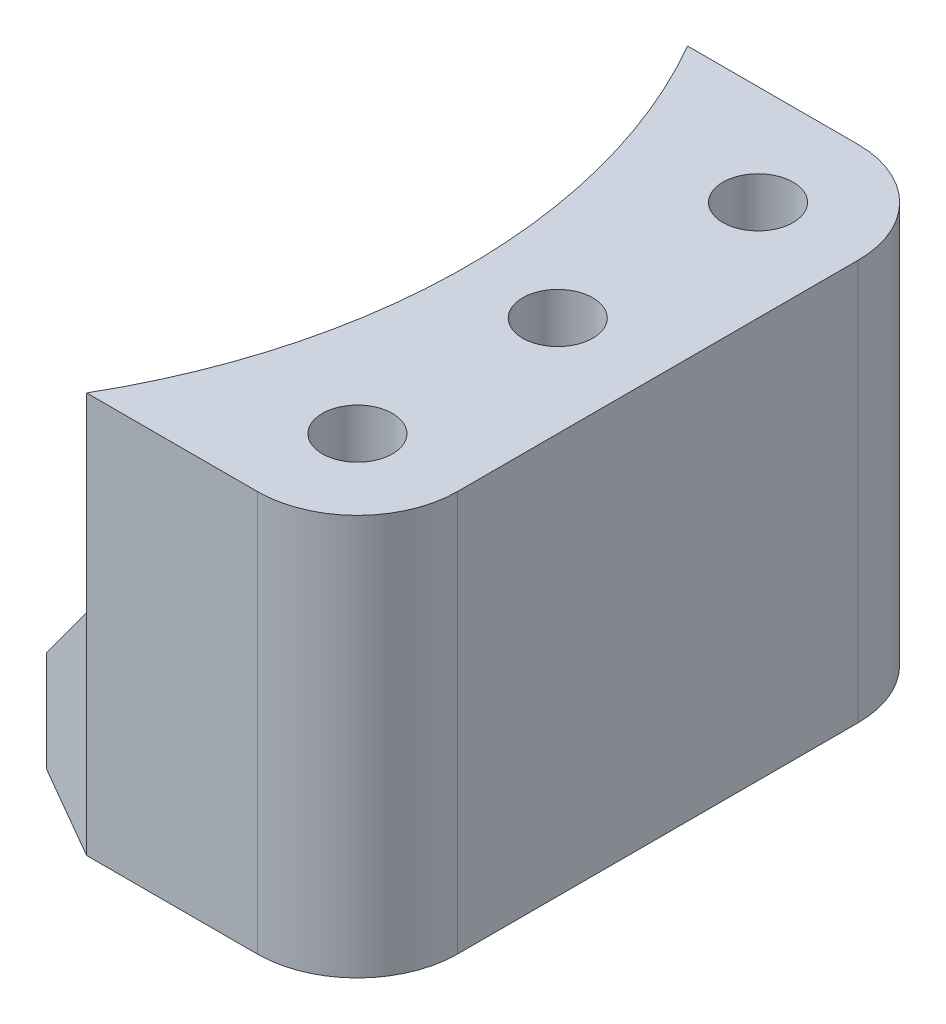
ISO-10303-21;
HEADER;
FILE_DESCRIPTION(('STEP AP214'),'2;1');
FILE_NAME('part.step','',(''),(''),'','','');
FILE_SCHEMA(('AUTOMOTIVE_DESIGN { 1 0 10303 214 1 1 1 1 }'));
ENDSEC;
DATA;
#1=APPLICATION_CONTEXT('core data for automotive mechanical design processes');
#2=APPLICATION_PROTOCOL_DEFINITION('international standard','automotive_design',2000,#1);
#3=PRODUCT_CONTEXT('',#1,'mechanical');
#4=PRODUCT('Part','Part','',(#3));
#5=PRODUCT_RELATED_PRODUCT_CATEGORY('part','',(#4));
#6=PRODUCT_DEFINITION_FORMATION('','',#4);
#7=PRODUCT_DEFINITION_CONTEXT('part definition',#1,'design');
#8=PRODUCT_DEFINITION('design','',#6,#7);
#9=PRODUCT_DEFINITION_SHAPE('','',#8);
#10=(LENGTH_UNIT() NAMED_UNIT(*) SI_UNIT(.MILLI.,.METRE.));
#11=(NAMED_UNIT(*) PLANE_ANGLE_UNIT() SI_UNIT($,.RADIAN.));
#12=(NAMED_UNIT(*) SI_UNIT($,.STERADIAN.) SOLID_ANGLE_UNIT());
#13=UNCERTAINTY_MEASURE_WITH_UNIT(LENGTH_MEASURE(1.E-05),#10,'distance_accuracy_value','');
#14=(GEOMETRIC_REPRESENTATION_CONTEXT(3) GLOBAL_UNCERTAINTY_ASSIGNED_CONTEXT((#13)) GLOBAL_UNIT_ASSIGNED_CONTEXT((#10,
#11,#12)) REPRESENTATION_CONTEXT('',''));
#15=CARTESIAN_POINT('',(0.,0.,0.));
#16=DIRECTION('',(0.,0.,1.));
#17=DIRECTION('',(1.,0.,0.));
#18=AXIS2_PLACEMENT_3D('',#15,#16,#17);
#19=CARTESIAN_POINT('',(38.5381304684075,20.,-22.25));
#20=DIRECTION('',(0.,1.,0.));
#21=DIRECTION('',(0.,0.,1.));
#22=AXIS2_PLACEMENT_3D('',#19,#20,#21);
#23=PLANE('',#22);
#24=CARTESIAN_POINT('',(34.5,20.,0.));
#25=DIRECTION('',(0.,1.,0.));
#26=DIRECTION('',(0.,0.,1.));
#27=AXIS2_PLACEMENT_3D('',#24,#25,#26);
#28=CIRCLE('',#27,1.75);
#29=CARTESIAN_POINT('',(34.5,20.,1.75));
#30=VERTEX_POINT('',#29);
#31=EDGE_CURVE('E187',#30,#30,#28,.T.);
#32=ORIENTED_EDGE('',*,*,#31,.F.);
#33=EDGE_LOOP('',(#32));
#34=FACE_BOUND('',#33,.T.);
#35=CARTESIAN_POINT('',(34.5,20.,-10.));
#36=DIRECTION('',(0.,1.,0.));
#37=DIRECTION('',(0.,0.,1.));
#38=AXIS2_PLACEMENT_3D('',#35,#36,#37);
#39=CIRCLE('',#38,1.75);
#40=CARTESIAN_POINT('',(34.5,20.,-8.25));
#41=VERTEX_POINT('',#40);
#42=EDGE_CURVE('E177',#41,#41,#39,.T.);
#43=ORIENTED_EDGE('',*,*,#42,.F.);
#44=EDGE_LOOP('',(#43));
#45=FACE_BOUND('',#44,.T.);
#46=CARTESIAN_POINT('',(34.5,20.,10.));
#47=DIRECTION('',(0.,1.,0.));
#48=DIRECTION('',(0.,0.,1.));
#49=AXIS2_PLACEMENT_3D('',#46,#47,#48);
#50=CIRCLE('',#49,1.75);
#51=CARTESIAN_POINT('',(34.5,20.,11.75));
#52=VERTEX_POINT('',#51);
#53=EDGE_CURVE('E174',#52,#52,#50,.T.);
#54=ORIENTED_EDGE('',*,*,#53,.F.);
#55=EDGE_LOOP('',(#54));
#56=FACE_BOUND('',#55,.T.);
#57=DIRECTION('',(0.,0.,1.));
#58=VECTOR('',#57,1.);
#59=CARTESIAN_POINT('',(39.5,20.,-22.25));
#60=LINE('',#59,#58);
#61=CARTESIAN_POINT('',(39.5,20.,-10.));
#62=VERTEX_POINT('',#61);
#63=CARTESIAN_POINT('',(39.5,20.,10.));
#64=VERTEX_POINT('',#63);
#65=EDGE_CURVE('E197',#62,#64,#60,.T.);
#66=ORIENTED_EDGE('',*,*,#65,.F.);
#67=CARTESIAN_POINT('',(34.5,20.,-10.));
#68=DIRECTION('',(0.,1.,0.));
#69=DIRECTION('',(0.,0.,1.));
#70=AXIS2_PLACEMENT_3D('',#67,#68,#69);
#71=CIRCLE('',#70,5.);
#72=CARTESIAN_POINT('',(34.5,20.,-15.));
#73=VERTEX_POINT('',#72);
#74=EDGE_CURVE('E42',#62,#73,#71,.T.);
#75=ORIENTED_EDGE('',*,*,#74,.T.);
#76=DIRECTION('',(1.,0.,0.));
#77=VECTOR('',#76,1.);
#78=CARTESIAN_POINT('',(38.5381304684075,20.,-15.));
#79=LINE('',#78,#77);
#80=CARTESIAN_POINT('',(25.9807621135331,20.,-15.));
#81=VERTEX_POINT('',#80);
#82=EDGE_CURVE('E194',#81,#73,#79,.T.);
#83=ORIENTED_EDGE('',*,*,#82,.F.);
#84=CARTESIAN_POINT('',(0.,20.,0.));
#85=DIRECTION('',(0.,-1.,0.));
#86=DIRECTION('',(0.,0.,-1.));
#87=AXIS2_PLACEMENT_3D('',#84,#85,#86);
#88=CIRCLE('',#87,30.);
#89=CARTESIAN_POINT('',(25.9807621135331,20.,15.));
#90=VERTEX_POINT('',#89);
#91=EDGE_CURVE('E115',#81,#90,#88,.T.);
#92=ORIENTED_EDGE('',*,*,#91,.T.);
#93=DIRECTION('',(-1.,0.,0.));
#94=VECTOR('',#93,1.);
#95=CARTESIAN_POINT('',(38.5381304684075,20.,15.));
#96=LINE('',#95,#94);
#97=CARTESIAN_POINT('',(34.5,20.,15.));
#98=VERTEX_POINT('',#97);
#99=EDGE_CURVE('E124',#98,#90,#96,.T.);
#100=ORIENTED_EDGE('',*,*,#99,.F.);
#101=CARTESIAN_POINT('',(34.5,20.,10.));
#102=DIRECTION('',(0.,1.,0.));
#103=DIRECTION('',(0.,0.,1.));
#104=AXIS2_PLACEMENT_3D('',#101,#102,#103);
#105=CIRCLE('',#104,5.);
#106=EDGE_CURVE('E55',#98,#64,#105,.T.);
#107=ORIENTED_EDGE('',*,*,#106,.T.);
#108=EDGE_LOOP('',(#66,#75,#83,#92,#100,#107));
#109=FACE_BOUND('',#108,.T.);
#110=ADVANCED_FACE('F33',(#34,#45,#56,#109),#23,.T.);
#111=CARTESIAN_POINT('',(0.,0.,0.));
#112=DIRECTION('',(0.,-1.,0.));
#113=DIRECTION('',(0.,0.,-1.));
#114=AXIS2_PLACEMENT_3D('',#111,#112,#113);
#115=CYLINDRICAL_SURFACE('',#114,30.);
#116=CARTESIAN_POINT('',(0.,10.5,0.));
#117=DIRECTION('',(0.,-1.,0.));
#118=DIRECTION('',(0.,0.,-1.));
#119=AXIS2_PLACEMENT_3D('',#116,#117,#118);
#120=CIRCLE('',#119,30.);
#121=CARTESIAN_POINT('',(25.9807621135331,10.4999999999999,-15.));
#122=VERTEX_POINT('',#121);
#123=CARTESIAN_POINT('',(25.9807621135331,10.5,15.));
#124=VERTEX_POINT('',#123);
#125=EDGE_CURVE('E152',#122,#124,#120,.T.);
#126=ORIENTED_EDGE('',*,*,#125,.T.);
#127=DIRECTION('',(0.,-1.,0.));
#128=VECTOR('',#127,1.);
#129=CARTESIAN_POINT('',(25.9807621135331,20.,15.));
#130=LINE('',#129,#128);
#131=EDGE_CURVE('E109',#90,#124,#130,.T.);
#132=ORIENTED_EDGE('',*,*,#131,.F.);
#133=ORIENTED_EDGE('',*,*,#91,.F.);
#134=DIRECTION('',(0.,-1.,0.));
#135=VECTOR('',#134,1.);
#136=CARTESIAN_POINT('',(25.9807621135331,20.,-15.));
#137=LINE('',#136,#135);
#138=EDGE_CURVE('E131',#81,#122,#137,.T.);
#139=ORIENTED_EDGE('',*,*,#138,.T.);
#140=EDGE_LOOP('',(#126,#132,#133,#139));
#141=FACE_BOUND('',#140,.T.);
#142=ADVANCED_FACE('F215',(#141),#115,.F.);
#143=CARTESIAN_POINT('',(0.,10.5,0.));
#144=DIRECTION('',(0.,1.,0.));
#145=DIRECTION('',(0.,0.,1.));
#146=AXIS2_PLACEMENT_3D('',#143,#144,#145);
#147=CONICAL_SURFACE('',#146,30.,0.785398163397451);
#148=CARTESIAN_POINT('',(0.,5.,0.));
#149=DIRECTION('',(0.,-1.,0.));
#150=DIRECTION('',(0.,0.,-1.));
#151=AXIS2_PLACEMENT_3D('',#148,#149,#150);
#152=CIRCLE('',#151,24.5);
#153=CARTESIAN_POINT('',(21.2176223927187,5.,-12.25));
#154=VERTEX_POINT('',#153);
#155=CARTESIAN_POINT('',(21.2176223927187,5.,12.25));
#156=VERTEX_POINT('',#155);
#157=EDGE_CURVE('E150',#154,#156,#152,.T.);
#158=ORIENTED_EDGE('',*,*,#157,.T.);
#159=DIRECTION('',(-0.612372435695795,-0.707106781186546,-0.353553390593275));
#160=VECTOR('',#159,1.);
#161=CARTESIAN_POINT('',(25.9807621135331,10.5,15.));
#162=LINE('',#161,#160);
#163=EDGE_CURVE('E136',#124,#156,#162,.T.);
#164=ORIENTED_EDGE('',*,*,#163,.F.);
#165=ORIENTED_EDGE('',*,*,#125,.F.);
#166=DIRECTION('',(-0.612372435695795,-0.707106781186546,0.353553390593275));
#167=VECTOR('',#166,1.);
#168=CARTESIAN_POINT('',(25.9807621135331,10.5,-15.));
#169=LINE('',#168,#167);
#170=EDGE_CURVE('E134',#122,#154,#169,.T.);
#171=ORIENTED_EDGE('',*,*,#170,.T.);
#172=EDGE_LOOP('',(#158,#164,#165,#171));
#173=FACE_BOUND('',#172,.T.);
#174=ADVANCED_FACE('F212',(#173),#147,.F.);
#175=CARTESIAN_POINT('',(0.,0.,0.));
#176=DIRECTION('',(0.,-1.,0.));
#177=DIRECTION('',(0.,0.,-1.));
#178=AXIS2_PLACEMENT_3D('',#175,#176,#177);
#179=CYLINDRICAL_SURFACE('',#178,24.5);
#180=CARTESIAN_POINT('',(0.,0.,0.));
#181=DIRECTION('',(0.,-1.,0.));
#182=DIRECTION('',(0.,0.,-1.));
#183=AXIS2_PLACEMENT_3D('',#180,#181,#182);
#184=CIRCLE('',#183,24.5);
#185=CARTESIAN_POINT('',(21.2176223927187,0.,-12.25));
#186=VERTEX_POINT('',#185);
#187=CARTESIAN_POINT('',(21.2176223927187,0.,12.25));
#188=VERTEX_POINT('',#187);
#189=EDGE_CURVE('E148',#186,#188,#184,.T.);
#190=ORIENTED_EDGE('',*,*,#189,.T.);
#191=DIRECTION('',(0.,-1.,0.));
#192=VECTOR('',#191,1.);
#193=CARTESIAN_POINT('',(21.2176223927187,5.,12.25));
#194=LINE('',#193,#192);
#195=EDGE_CURVE('E130',#156,#188,#194,.T.);
#196=ORIENTED_EDGE('',*,*,#195,.F.);
#197=ORIENTED_EDGE('',*,*,#157,.F.);
#198=DIRECTION('',(0.,-1.,0.));
#199=VECTOR('',#198,1.);
#200=CARTESIAN_POINT('',(21.2176223927187,5.,-12.25));
#201=LINE('',#200,#199);
#202=EDGE_CURVE('E142',#154,#186,#201,.T.);
#203=ORIENTED_EDGE('',*,*,#202,.T.);
#204=EDGE_LOOP('',(#190,#196,#197,#203));
#205=FACE_BOUND('',#204,.T.);
#206=ADVANCED_FACE('F203',(#205),#179,.F.);
#207=CARTESIAN_POINT('',(21.2176223927187,0.,-12.25));
#208=DIRECTION('',(0.,-1.,0.));
#209=DIRECTION('',(0.,0.,-1.));
#210=AXIS2_PLACEMENT_3D('',#207,#208,#209);
#211=PLANE('',#210);
#212=CARTESIAN_POINT('',(34.5,0.,0.));
#213=DIRECTION('',(0.,-1.,0.));
#214=DIRECTION('',(0.,0.,-1.));
#215=AXIS2_PLACEMENT_3D('',#212,#213,#214);
#216=CIRCLE('',#215,1.75);
#217=CARTESIAN_POINT('',(34.5,0.,-1.75));
#218=VERTEX_POINT('',#217);
#219=EDGE_CURVE('E37',#218,#218,#216,.T.);
#220=ORIENTED_EDGE('',*,*,#219,.F.);
#221=EDGE_LOOP('',(#220));
#222=FACE_BOUND('',#221,.T.);
#223=CARTESIAN_POINT('',(34.5,0.,-10.));
#224=DIRECTION('',(0.,-1.,0.));
#225=DIRECTION('',(0.,0.,-1.));
#226=AXIS2_PLACEMENT_3D('',#223,#224,#225);
#227=CIRCLE('',#226,1.75);
#228=CARTESIAN_POINT('',(34.5,0.,-11.75));
#229=VERTEX_POINT('',#228);
#230=EDGE_CURVE('E175',#229,#229,#227,.T.);
#231=ORIENTED_EDGE('',*,*,#230,.F.);
#232=EDGE_LOOP('',(#231));
#233=FACE_BOUND('',#232,.T.);
#234=CARTESIAN_POINT('',(34.5,0.,10.));
#235=DIRECTION('',(0.,-1.,0.));
#236=DIRECTION('',(0.,0.,-1.));
#237=AXIS2_PLACEMENT_3D('',#234,#235,#236);
#238=CIRCLE('',#237,1.75);
#239=CARTESIAN_POINT('',(34.5,0.,8.25));
#240=VERTEX_POINT('',#239);
#241=EDGE_CURVE('E171',#240,#240,#238,.T.);
#242=ORIENTED_EDGE('',*,*,#241,.F.);
#243=EDGE_LOOP('',(#242));
#244=FACE_BOUND('',#243,.T.);
#245=DIRECTION('',(-1.,0.,0.));
#246=VECTOR('',#245,1.);
#247=CARTESIAN_POINT('',(39.5,0.,-15.));
#248=LINE('',#247,#246);
#249=CARTESIAN_POINT('',(34.5,0.,-15.));
#250=VERTEX_POINT('',#249);
#251=CARTESIAN_POINT('',(25.9807621135331,0.,-15.));
#252=VERTEX_POINT('',#251);
#253=EDGE_CURVE('E125',#250,#252,#248,.T.);
#254=ORIENTED_EDGE('',*,*,#253,.F.);
#255=CARTESIAN_POINT('',(34.5,0.,-10.));
#256=DIRECTION('',(0.,-1.,0.));
#257=DIRECTION('',(0.,0.,-1.));
#258=AXIS2_PLACEMENT_3D('',#255,#256,#257);
#259=CIRCLE('',#258,5.);
#260=CARTESIAN_POINT('',(39.5,0.,-9.99999999999999));
#261=VERTEX_POINT('',#260);
#262=EDGE_CURVE('E162',#250,#261,#259,.T.);
#263=ORIENTED_EDGE('',*,*,#262,.T.);
#264=DIRECTION('',(0.,0.,-1.));
#265=VECTOR('',#264,1.);
#266=CARTESIAN_POINT('',(39.5,0.,15.));
#267=LINE('',#266,#265);
#268=CARTESIAN_POINT('',(39.5,0.,10.));
#269=VERTEX_POINT('',#268);
#270=EDGE_CURVE('E173',#269,#261,#267,.T.);
#271=ORIENTED_EDGE('',*,*,#270,.F.);
#272=CARTESIAN_POINT('',(34.5,0.,10.));
#273=DIRECTION('',(0.,-1.,0.));
#274=DIRECTION('',(0.,0.,-1.));
#275=AXIS2_PLACEMENT_3D('',#272,#273,#274);
#276=CIRCLE('',#275,5.);
#277=CARTESIAN_POINT('',(34.5,0.,15.));
#278=VERTEX_POINT('',#277);
#279=EDGE_CURVE('E123',#269,#278,#276,.T.);
#280=ORIENTED_EDGE('',*,*,#279,.T.);
#281=DIRECTION('',(1.,0.,0.));
#282=VECTOR('',#281,1.);
#283=CARTESIAN_POINT('',(39.5,0.,15.));
#284=LINE('',#283,#282);
#285=CARTESIAN_POINT('',(25.9807621135331,0.,15.));
#286=VERTEX_POINT('',#285);
#287=EDGE_CURVE('E107',#286,#278,#284,.T.);
#288=ORIENTED_EDGE('',*,*,#287,.F.);
#289=DIRECTION('',(0.866025403784438,0.,0.500000000000001));
#290=VECTOR('',#289,1.);
#291=CARTESIAN_POINT('',(21.2176223927187,0.,12.25));
#292=LINE('',#291,#290);
#293=EDGE_CURVE('E121',#188,#286,#292,.T.);
#294=ORIENTED_EDGE('',*,*,#293,.F.);
#295=ORIENTED_EDGE('',*,*,#189,.F.);
#296=DIRECTION('',(0.866025403784438,0.,-0.500000000000001));
#297=VECTOR('',#296,1.);
#298=CARTESIAN_POINT('',(21.2176223927187,0.,-12.25));
#299=LINE('',#298,#297);
#300=EDGE_CURVE('E145',#186,#252,#299,.T.);
#301=ORIENTED_EDGE('',*,*,#300,.T.);
#302=EDGE_LOOP('',(#254,#263,#271,#280,#288,#294,#295,#301));
#303=FACE_BOUND('',#302,.T.);
#304=ADVANCED_FACE('F120',(#222,#233,#244,#303),#211,.T.);
#305=CARTESIAN_POINT('',(0.,0.,0.));
#306=DIRECTION('',(0.500000000000001,0.,0.866025403784438));
#307=DIRECTION('',(0.866025403784438,0.,-0.500000000000001));
#308=AXIS2_PLACEMENT_3D('',#305,#306,#307);
#309=PLANE('',#308);
#310=ORIENTED_EDGE('',*,*,#170,.F.);
#311=DIRECTION('',(0.,-1.,0.));
#312=VECTOR('',#311,1.);
#313=CARTESIAN_POINT('',(25.9807621135331,0.,-15.));
#314=LINE('',#313,#312);
#315=EDGE_CURVE('E114',#122,#252,#314,.T.);
#316=ORIENTED_EDGE('',*,*,#315,.T.);
#317=ORIENTED_EDGE('',*,*,#300,.F.);
#318=ORIENTED_EDGE('',*,*,#202,.F.);
#319=EDGE_LOOP('',(#310,#316,#317,#318));
#320=FACE_BOUND('',#319,.T.);
#321=ADVANCED_FACE('F208',(#320),#309,.F.);
#322=CARTESIAN_POINT('',(0.,0.,0.));
#323=DIRECTION('',(-0.500000000000001,0.,0.866025403784438));
#324=DIRECTION('',(0.866025403784438,0.,0.500000000000001));
#325=AXIS2_PLACEMENT_3D('',#322,#323,#324);
#326=PLANE('',#325);
#327=DIRECTION('',(0.,-1.,0.));
#328=VECTOR('',#327,1.);
#329=CARTESIAN_POINT('',(25.9807621135331,0.,15.));
#330=LINE('',#329,#328);
#331=EDGE_CURVE('E104',#124,#286,#330,.T.);
#332=ORIENTED_EDGE('',*,*,#331,.F.);
#333=ORIENTED_EDGE('',*,*,#163,.T.);
#334=ORIENTED_EDGE('',*,*,#195,.T.);
#335=ORIENTED_EDGE('',*,*,#293,.T.);
#336=EDGE_LOOP('',(#332,#333,#334,#335));
#337=FACE_BOUND('',#336,.T.);
#338=ADVANCED_FACE('F128',(#337),#326,.T.);
#339=CARTESIAN_POINT('',(39.5,40.,15.));
#340=DIRECTION('',(-1.,0.,0.));
#341=DIRECTION('',(0.,0.,1.));
#342=AXIS2_PLACEMENT_3D('',#339,#340,#341);
#343=PLANE('',#342);
#344=ORIENTED_EDGE('',*,*,#270,.T.);
#345=DIRECTION('',(0.,-1.,0.));
#346=VECTOR('',#345,1.);
#347=CARTESIAN_POINT('',(39.5,40.,-9.99999999999999));
#348=LINE('',#347,#346);
#349=EDGE_CURVE('E167',#261,#62,#348,.F.);
#350=ORIENTED_EDGE('',*,*,#349,.T.);
#351=ORIENTED_EDGE('',*,*,#65,.T.);
#352=DIRECTION('',(0.,-1.,0.));
#353=VECTOR('',#352,1.);
#354=CARTESIAN_POINT('',(39.5,40.,10.));
#355=LINE('',#354,#353);
#356=EDGE_CURVE('E164',#64,#269,#355,.T.);
#357=ORIENTED_EDGE('',*,*,#356,.T.);
#358=EDGE_LOOP('',(#344,#350,#351,#357));
#359=FACE_BOUND('',#358,.T.);
#360=ADVANCED_FACE('F222',(#359),#343,.F.);
#361=CARTESIAN_POINT('',(39.5,40.,-15.));
#362=DIRECTION('',(0.,0.,1.));
#363=DIRECTION('',(1.,0.,0.));
#364=AXIS2_PLACEMENT_3D('',#361,#362,#363);
#365=PLANE('',#364);
#366=ORIENTED_EDGE('',*,*,#82,.T.);
#367=DIRECTION('',(0.,-1.,0.));
#368=VECTOR('',#367,1.);
#369=CARTESIAN_POINT('',(34.5,40.,-15.));
#370=LINE('',#369,#368);
#371=EDGE_CURVE('E158',#73,#250,#370,.T.);
#372=ORIENTED_EDGE('',*,*,#371,.T.);
#373=ORIENTED_EDGE('',*,*,#253,.T.);
#374=ORIENTED_EDGE('',*,*,#315,.F.);
#375=ORIENTED_EDGE('',*,*,#138,.F.);
#376=EDGE_LOOP('',(#366,#372,#373,#374,#375));
#377=FACE_BOUND('',#376,.T.);
#378=ADVANCED_FACE('F210',(#377),#365,.F.);
#379=CARTESIAN_POINT('',(39.5,40.,15.));
#380=DIRECTION('',(0.,0.,-1.));
#381=DIRECTION('',(-1.,0.,0.));
#382=AXIS2_PLACEMENT_3D('',#379,#380,#381);
#383=PLANE('',#382);
#384=ORIENTED_EDGE('',*,*,#287,.T.);
#385=DIRECTION('',(0.,-1.,0.));
#386=VECTOR('',#385,1.);
#387=CARTESIAN_POINT('',(34.5,40.,15.));
#388=LINE('',#387,#386);
#389=EDGE_CURVE('E12',#278,#98,#388,.F.);
#390=ORIENTED_EDGE('',*,*,#389,.T.);
#391=ORIENTED_EDGE('',*,*,#99,.T.);
#392=ORIENTED_EDGE('',*,*,#131,.T.);
#393=ORIENTED_EDGE('',*,*,#331,.T.);
#394=EDGE_LOOP('',(#384,#390,#391,#392,#393));
#395=FACE_BOUND('',#394,.T.);
#396=ADVANCED_FACE('F106',(#395),#383,.F.);
#397=CARTESIAN_POINT('',(34.5,40.,-10.));
#398=DIRECTION('',(0.,-1.,0.));
#399=DIRECTION('',(0.,0.,-1.));
#400=AXIS2_PLACEMENT_3D('',#397,#398,#399);
#401=CYLINDRICAL_SURFACE('',#400,5.);
#402=ORIENTED_EDGE('',*,*,#74,.F.);
#403=ORIENTED_EDGE('',*,*,#349,.F.);
#404=ORIENTED_EDGE('',*,*,#262,.F.);
#405=ORIENTED_EDGE('',*,*,#371,.F.);
#406=EDGE_LOOP('',(#402,#403,#404,#405));
#407=FACE_BOUND('',#406,.T.);
#408=ADVANCED_FACE('F219',(#407),#401,.T.);
#409=CARTESIAN_POINT('',(34.5,40.,10.));
#410=DIRECTION('',(0.,-1.,0.));
#411=DIRECTION('',(0.,0.,-1.));
#412=AXIS2_PLACEMENT_3D('',#409,#410,#411);
#413=CYLINDRICAL_SURFACE('',#412,5.);
#414=ORIENTED_EDGE('',*,*,#106,.F.);
#415=ORIENTED_EDGE('',*,*,#389,.F.);
#416=ORIENTED_EDGE('',*,*,#279,.F.);
#417=ORIENTED_EDGE('',*,*,#356,.F.);
#418=EDGE_LOOP('',(#414,#415,#416,#417));
#419=FACE_BOUND('',#418,.T.);
#420=ADVANCED_FACE('F35',(#419),#413,.T.);
#421=CARTESIAN_POINT('',(34.5,-20.,10.));
#422=DIRECTION('',(0.,1.,0.));
#423=DIRECTION('',(0.,0.,1.));
#424=AXIS2_PLACEMENT_3D('',#421,#422,#423);
#425=CYLINDRICAL_SURFACE('',#424,1.75);
#426=ORIENTED_EDGE('',*,*,#241,.T.);
#427=EDGE_LOOP('',(#426));
#428=FACE_BOUND('',#427,.T.);
#429=ORIENTED_EDGE('',*,*,#53,.T.);
#430=EDGE_LOOP('',(#429));
#431=FACE_BOUND('',#430,.T.);
#432=ADVANCED_FACE('F226',(#428,#431),#425,.F.);
#433=CARTESIAN_POINT('',(34.5,-20.,-10.));
#434=DIRECTION('',(0.,1.,0.));
#435=DIRECTION('',(0.,0.,1.));
#436=AXIS2_PLACEMENT_3D('',#433,#434,#435);
#437=CYLINDRICAL_SURFACE('',#436,1.75);
#438=ORIENTED_EDGE('',*,*,#230,.T.);
#439=EDGE_LOOP('',(#438));
#440=FACE_BOUND('',#439,.T.);
#441=ORIENTED_EDGE('',*,*,#42,.T.);
#442=EDGE_LOOP('',(#441));
#443=FACE_BOUND('',#442,.T.);
#444=ADVANCED_FACE('F231',(#440,#443),#437,.F.);
#445=CARTESIAN_POINT('',(34.5,-20.,0.));
#446=DIRECTION('',(0.,1.,0.));
#447=DIRECTION('',(0.,0.,1.));
#448=AXIS2_PLACEMENT_3D('',#445,#446,#447);
#449=CYLINDRICAL_SURFACE('',#448,1.75);
#450=ORIENTED_EDGE('',*,*,#219,.T.);
#451=EDGE_LOOP('',(#450));
#452=FACE_BOUND('',#451,.T.);
#453=ORIENTED_EDGE('',*,*,#31,.T.);
#454=EDGE_LOOP('',(#453));
#455=FACE_BOUND('',#454,.T.);
#456=ADVANCED_FACE('F339',(#452,#455),#449,.F.);
#457=CLOSED_SHELL('',(#110,#142,#174,#206,#304,#321,#338,#360,#378,#396,#408,#420,#432,#444,#456));
#458=MANIFOLD_SOLID_BREP('B2',#457);
#459=ADVANCED_BREP_SHAPE_REPRESENTATION('',(#18,#458),#14);
#460=SHAPE_DEFINITION_REPRESENTATION(#9,#459);
ENDSEC;
END-ISO-10303-21;
